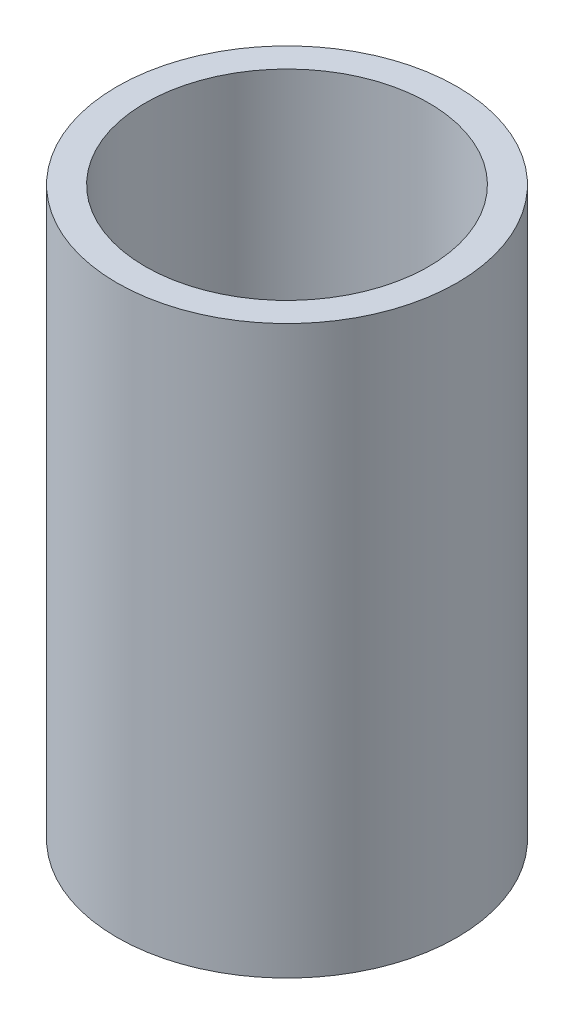
ISO-10303-21;
HEADER;
FILE_DESCRIPTION(('STEP AP214'),'2;1');
FILE_NAME('part.step','',(''),(''),'','','');
FILE_SCHEMA(('AUTOMOTIVE_DESIGN { 1 0 10303 214 1 1 1 1 }'));
ENDSEC;
DATA;
#1=APPLICATION_CONTEXT('core data for automotive mechanical design processes');
#2=APPLICATION_PROTOCOL_DEFINITION('international standard','automotive_design',2000,#1);
#3=PRODUCT_CONTEXT('',#1,'mechanical');
#4=PRODUCT('Part','Part','',(#3));
#5=PRODUCT_RELATED_PRODUCT_CATEGORY('part','',(#4));
#6=PRODUCT_DEFINITION_FORMATION('','',#4);
#7=PRODUCT_DEFINITION_CONTEXT('part definition',#1,'design');
#8=PRODUCT_DEFINITION('design','',#6,#7);
#9=PRODUCT_DEFINITION_SHAPE('','',#8);
#10=(LENGTH_UNIT() NAMED_UNIT(*) SI_UNIT(.MILLI.,.METRE.));
#11=(NAMED_UNIT(*) PLANE_ANGLE_UNIT() SI_UNIT($,.RADIAN.));
#12=(NAMED_UNIT(*) SI_UNIT($,.STERADIAN.) SOLID_ANGLE_UNIT());
#13=UNCERTAINTY_MEASURE_WITH_UNIT(LENGTH_MEASURE(1.E-05),#10,'distance_accuracy_value','');
#14=(GEOMETRIC_REPRESENTATION_CONTEXT(3) GLOBAL_UNCERTAINTY_ASSIGNED_CONTEXT((#13)) GLOBAL_UNIT_ASSIGNED_CONTEXT((#10,
#11,#12)) REPRESENTATION_CONTEXT('',''));
#15=CARTESIAN_POINT('',(0.,0.,0.));
#16=DIRECTION('',(0.,0.,1.));
#17=DIRECTION('',(1.,0.,0.));
#18=AXIS2_PLACEMENT_3D('',#15,#16,#17);
#19=CARTESIAN_POINT('',(0.,180.,18.));
#20=DIRECTION('',(0.,1.,0.));
#21=DIRECTION('',(0.,0.,1.));
#22=AXIS2_PLACEMENT_3D('',#19,#20,#21);
#23=CYLINDRICAL_SURFACE('',#22,5.0005);
#24=CARTESIAN_POINT('',(0.,190.,18.));
#25=DIRECTION('',(0.,1.,0.));
#26=DIRECTION('',(0.,0.,1.));
#27=AXIS2_PLACEMENT_3D('',#24,#25,#26);
#28=CIRCLE('',#27,5.0005);
#29=CARTESIAN_POINT('',(0.,190.,23.0005));
#30=VERTEX_POINT('',#29);
#31=EDGE_CURVE('E18',#30,#30,#28,.F.);
#32=ORIENTED_EDGE('',*,*,#31,.F.);
#33=EDGE_LOOP('',(#32));
#34=FACE_BOUND('',#33,.T.);
#35=CARTESIAN_POINT('',(0.,170.,18.));
#36=DIRECTION('',(0.,1.,0.));
#37=DIRECTION('',(0.,0.,1.));
#38=AXIS2_PLACEMENT_3D('',#35,#36,#37);
#39=CIRCLE('',#38,5.0005);
#40=CARTESIAN_POINT('',(0.,170.,23.0005));
#41=VERTEX_POINT('',#40);
#42=EDGE_CURVE('E27',#41,#41,#39,.T.);
#43=ORIENTED_EDGE('',*,*,#42,.F.);
#44=EDGE_LOOP('',(#43));
#45=FACE_BOUND('',#44,.T.);
#46=ADVANCED_FACE('F15',(#34,#45),#23,.F.);
#47=CARTESIAN_POINT('',(-5.5,190.,18.));
#48=DIRECTION('',(0.,1.,0.));
#49=DIRECTION('',(0.,0.,1.));
#50=AXIS2_PLACEMENT_3D('',#47,#48,#49);
#51=PLANE('',#50);
#52=ORIENTED_EDGE('',*,*,#31,.T.);
#53=EDGE_LOOP('',(#52));
#54=FACE_BOUND('',#53,.T.);
#55=CARTESIAN_POINT('',(0.,190.,18.));
#56=DIRECTION('',(0.,1.,0.));
#57=DIRECTION('',(0.,0.,1.));
#58=AXIS2_PLACEMENT_3D('',#55,#56,#57);
#59=CIRCLE('',#58,5.9995);
#60=CARTESIAN_POINT('',(0.,190.,23.9995));
#61=VERTEX_POINT('',#60);
#62=EDGE_CURVE('E22',#61,#61,#59,.F.);
#63=ORIENTED_EDGE('',*,*,#62,.F.);
#64=EDGE_LOOP('',(#63));
#65=FACE_BOUND('',#64,.T.);
#66=ADVANCED_FACE('F35',(#54,#65),#51,.T.);
#67=CARTESIAN_POINT('',(-5.5,170.,18.));
#68=DIRECTION('',(0.,-1.,0.));
#69=DIRECTION('',(0.,0.,-1.));
#70=AXIS2_PLACEMENT_3D('',#67,#68,#69);
#71=PLANE('',#70);
#72=CARTESIAN_POINT('',(0.,170.,18.));
#73=DIRECTION('',(0.,1.,0.));
#74=DIRECTION('',(0.,0.,1.));
#75=AXIS2_PLACEMENT_3D('',#72,#73,#74);
#76=CIRCLE('',#75,5.9995);
#77=CARTESIAN_POINT('',(0.,170.,23.9995));
#78=VERTEX_POINT('',#77);
#79=EDGE_CURVE('E10',#78,#78,#76,.T.);
#80=ORIENTED_EDGE('',*,*,#79,.F.);
#81=EDGE_LOOP('',(#80));
#82=FACE_BOUND('',#81,.T.);
#83=ORIENTED_EDGE('',*,*,#42,.T.);
#84=EDGE_LOOP('',(#83));
#85=FACE_BOUND('',#84,.T.);
#86=ADVANCED_FACE('F45',(#82,#85),#71,.T.);
#87=CARTESIAN_POINT('',(0.,180.,18.));
#88=DIRECTION('',(0.,1.,0.));
#89=DIRECTION('',(0.,0.,1.));
#90=AXIS2_PLACEMENT_3D('',#87,#88,#89);
#91=CYLINDRICAL_SURFACE('',#90,5.9995);
#92=ORIENTED_EDGE('',*,*,#62,.T.);
#93=EDGE_LOOP('',(#92));
#94=FACE_BOUND('',#93,.T.);
#95=ORIENTED_EDGE('',*,*,#79,.T.);
#96=EDGE_LOOP('',(#95));
#97=FACE_BOUND('',#96,.T.);
#98=ADVANCED_FACE('F46',(#94,#97),#91,.T.);
#99=CLOSED_SHELL('',(#46,#66,#86,#98));
#100=MANIFOLD_SOLID_BREP('B1',#99);
#101=ADVANCED_BREP_SHAPE_REPRESENTATION('',(#18,#100),#14);
#102=SHAPE_DEFINITION_REPRESENTATION(#9,#101);
ENDSEC;
END-ISO-10303-21;
